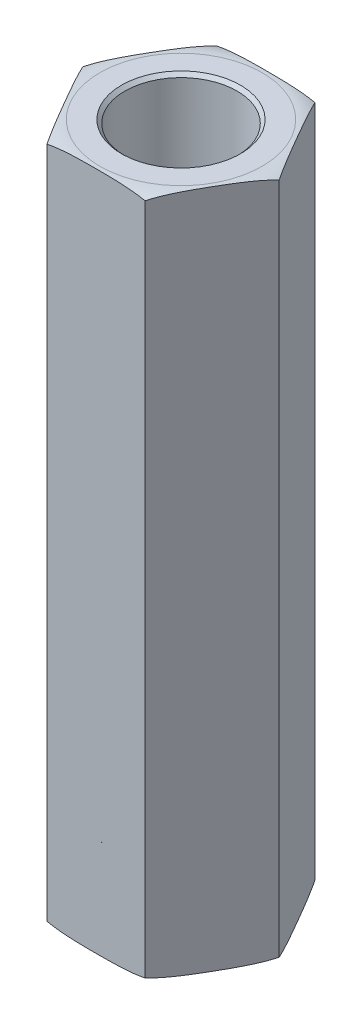
ISO-10303-21;
HEADER;
FILE_DESCRIPTION(('STEP AP214'),'2;1');
FILE_NAME('part.step','',(''),(''),'','','');
FILE_SCHEMA(('AUTOMOTIVE_DESIGN { 1 0 10303 214 1 1 1 1 }'));
ENDSEC;
DATA;
#1=APPLICATION_CONTEXT('core data for automotive mechanical design processes');
#2=APPLICATION_PROTOCOL_DEFINITION('international standard','automotive_design',2000,#1);
#3=PRODUCT_CONTEXT('',#1,'mechanical');
#4=PRODUCT('Part','Part','',(#3));
#5=PRODUCT_RELATED_PRODUCT_CATEGORY('part','',(#4));
#6=PRODUCT_DEFINITION_FORMATION('','',#4);
#7=PRODUCT_DEFINITION_CONTEXT('part definition',#1,'design');
#8=PRODUCT_DEFINITION('design','',#6,#7);
#9=PRODUCT_DEFINITION_SHAPE('','',#8);
#10=(LENGTH_UNIT() NAMED_UNIT(*) SI_UNIT(.MILLI.,.METRE.));
#11=(NAMED_UNIT(*) PLANE_ANGLE_UNIT() SI_UNIT($,.RADIAN.));
#12=(NAMED_UNIT(*) SI_UNIT($,.STERADIAN.) SOLID_ANGLE_UNIT());
#13=UNCERTAINTY_MEASURE_WITH_UNIT(LENGTH_MEASURE(1.E-05),#10,'distance_accuracy_value','');
#14=(GEOMETRIC_REPRESENTATION_CONTEXT(3) GLOBAL_UNCERTAINTY_ASSIGNED_CONTEXT((#13)) GLOBAL_UNIT_ASSIGNED_CONTEXT((#10,
#11,#12)) REPRESENTATION_CONTEXT('',''));
#15=CARTESIAN_POINT('',(0.,0.,0.));
#16=DIRECTION('',(0.,0.,1.));
#17=DIRECTION('',(1.,0.,0.));
#18=AXIS2_PLACEMENT_3D('',#15,#16,#17);
#19=CARTESIAN_POINT('',(3.66617420935412,12.7,0.));
#20=DIRECTION('',(-0.866025403784439,0.,0.5));
#21=DIRECTION('',(0.5,0.,0.866025403784439));
#22=AXIS2_PLACEMENT_3D('',#19,#20,#21);
#23=PLANE('',#22);
#24=CARTESIAN_POINT('',(3.66617420935412,12.573,0.));
#25=CARTESIAN_POINT('',(3.63753042799203,12.5849320246871,-0.0496124846400297));
#26=CARTESIAN_POINT('',(3.60875945805375,12.5955561469422,-0.0994452663561621));
#27=CARTESIAN_POINT('',(3.55104459418749,12.6145286938045,-0.199410342924443));
#28=CARTESIAN_POINT('',(3.52210079717003,12.6228782900808,-0.249542469922647));
#29=CARTESIAN_POINT('',(3.43520914920619,12.6450101508422,-0.400043218949403));
#30=CARTESIAN_POINT('',(3.37708055050428,12.6559225383995,-0.500724905273905));
#31=CARTESIAN_POINT('',(3.26070078255247,12.6725474670846,-0.702300576339511));
#32=CARTESIAN_POINT('',(3.20244972255354,12.6782635139361,-0.8031943718524));
#33=CARTESIAN_POINT('',(3.08586365366194,12.6865432523867,-1.00512736662738));
#34=CARTESIAN_POINT('',(3.0275286156277,12.6891051045623,-1.10616661636415));
#35=CARTESIAN_POINT('',(2.91138213832277,12.6924800878033,-1.30733821617643));
#36=CARTESIAN_POINT('',(2.85357078573449,12.6933089853076,-1.40747041611362));
#37=CARTESIAN_POINT('',(2.73795502274295,12.6939023514638,-1.6077227917708));
#38=CARTESIAN_POINT('',(2.68015061252637,12.6936669720032,-1.70784296716747));
#39=CARTESIAN_POINT('',(2.56452713843035,12.6919339874816,-1.9081086988494));
#40=CARTESIAN_POINT('',(2.50670807591211,12.6904359712302,-2.00825425277698));
#41=CARTESIAN_POINT('',(2.39109525560095,12.6851753167458,-2.20850153156225));
#42=CARTESIAN_POINT('',(2.33330149587791,12.6814129013609,-2.30860325976299));
#43=CARTESIAN_POINT('',(2.23849359853905,12.6719889930382,-2.47281535491267));
#44=CARTESIAN_POINT('',(2.20145192539189,12.6674905766377,-2.5369734148009));
#45=CARTESIAN_POINT('',(2.1274706070678,12.6563014819949,-2.66511281694915));
#46=CARTESIAN_POINT('',(2.09053091530158,12.6496120720916,-2.72909423990419));
#47=CARTESIAN_POINT('',(2.01669860633927,12.6333978038658,-2.85697555026704));
#48=CARTESIAN_POINT('',(1.97980639337019,12.6238652500622,-2.92087473753313));
#49=CARTESIAN_POINT('',(1.90623831426151,12.6012629144562,-3.04829838836461));
#50=CARTESIAN_POINT('',(1.86956287153406,12.5881876787821,-3.11182211855864));
#51=CARTESIAN_POINT('',(1.83308710467706,12.573,-3.175));
#52=B_SPLINE_CURVE_WITH_KNOTS('',3,(#24,#25,#26,#27,#28,#29,#30,#31,#32,#33,#34,#35,#36,#37,#38,
#39,#40,#41,#42,#43,#44,#45,#46,#47,#48,#49,#50,#51),.UNSPECIFIED.,.F.,.F.,(4,2,2,2,2,2,2,2,2,2,
2,2,2,4),(0.,0.175509467388228,0.35092835344326,0.701031261588516,1.05089779629359,
1.400968265255,1.7478396775804,2.09466158796891,2.44159648808714,2.78849725058557,
3.0111319819995,3.23363806003518,3.45675194236249,3.68021127402553),.UNSPECIFIED.);
#53=CARTESIAN_POINT('',(3.66617420935412,12.573,0.));
#54=VERTEX_POINT('',#53);
#55=CARTESIAN_POINT('',(1.83308710467705,12.573,-3.175));
#56=VERTEX_POINT('',#55);
#57=EDGE_CURVE('E107',#54,#56,#52,.T.);
#58=ORIENTED_EDGE('',*,*,#57,.F.);
#59=DIRECTION('',(0.,1.,0.));
#60=VECTOR('',#59,1.);
#61=CARTESIAN_POINT('',(3.66617420935412,12.7,0.));
#62=LINE('',#61,#60);
#63=CARTESIAN_POINT('',(3.66617420935412,-12.573,0.));
#64=VERTEX_POINT('',#63);
#65=EDGE_CURVE('E80',#54,#64,#62,.F.);
#66=ORIENTED_EDGE('',*,*,#65,.T.);
#67=CARTESIAN_POINT('',(1.83308710467705,-12.573,-3.17500000000001));
#68=CARTESIAN_POINT('',(1.86173088603914,-12.5849320246871,-3.12538751535998));
#69=CARTESIAN_POINT('',(1.89050185597742,-12.5955561469422,-3.07555473364385));
#70=CARTESIAN_POINT('',(1.94821671984367,-12.6145286938045,-2.97558965707557));
#71=CARTESIAN_POINT('',(1.97716051686113,-12.6228782900808,-2.92545753007737));
#72=CARTESIAN_POINT('',(2.06405216482497,-12.6450101508422,-2.77495678105062));
#73=CARTESIAN_POINT('',(2.12218076352688,-12.6559225383995,-2.67427509472612));
#74=CARTESIAN_POINT('',(2.23856053147869,-12.6725474670846,-2.47269942366052));
#75=CARTESIAN_POINT('',(2.29681159147761,-12.6782635139361,-2.37180562814763));
#76=CARTESIAN_POINT('',(2.41339766036921,-12.6865432523867,-2.16987263337266));
#77=CARTESIAN_POINT('',(2.47173269840345,-12.6891051045623,-2.06883338363589));
#78=CARTESIAN_POINT('',(2.58787917570837,-12.6924800878033,-1.86766178382362));
#79=CARTESIAN_POINT('',(2.64569052829666,-12.6933089853076,-1.76752958388644));
#80=CARTESIAN_POINT('',(2.76130629128819,-12.6939023514638,-1.56727720822926));
#81=CARTESIAN_POINT('',(2.81911070150477,-12.6936669720032,-1.4671570328326));
#82=CARTESIAN_POINT('',(2.93473417560078,-12.6919339874816,-1.26689130115068));
#83=CARTESIAN_POINT('',(2.99255323811901,-12.6904359712303,-1.16674574722309));
#84=CARTESIAN_POINT('',(3.10816605843017,-12.6851753167458,-0.966498468437835));
#85=CARTESIAN_POINT('',(3.16595981815321,-12.6814129013609,-0.866396740237102));
#86=CARTESIAN_POINT('',(3.26076771549208,-12.6719889930382,-0.702184645087417));
#87=CARTESIAN_POINT('',(3.29780938863924,-12.6674905766377,-0.638026585199176));
#88=CARTESIAN_POINT('',(3.37179070696334,-12.6563014819949,-0.509887183050907));
#89=CARTESIAN_POINT('',(3.40873039872957,-12.6496120720916,-0.445905760095859));
#90=CARTESIAN_POINT('',(3.48256270769189,-12.6333978038658,-0.318024449733001));
#91=CARTESIAN_POINT('',(3.51945492066097,-12.6238652500622,-0.254125262466904));
#92=CARTESIAN_POINT('',(3.59302299976965,-12.6012629144562,-0.126701611635409));
#93=CARTESIAN_POINT('',(3.62969844249711,-12.5881876787821,-0.0631778814413716));
#94=CARTESIAN_POINT('',(3.66617420935412,-12.573,0.));
#95=B_SPLINE_CURVE_WITH_KNOTS('',3,(#67,#68,#69,#70,#71,#72,#73,#74,#75,#76,#77,#78,#79,#80,#81,
#82,#83,#84,#85,#86,#87,#88,#89,#90,#91,#92,#93,#94),.UNSPECIFIED.,.F.,.F.,(4,2,2,2,2,2,2,2,2,2,
2,2,2,4),(0.,0.175509467388222,0.350928353443249,0.701031261588492,1.05089779629356,
1.40096826525495,1.74783967758033,2.09466158796884,2.44159648808706,2.78849725058547,
3.01113198199943,3.23363806003513,3.45675194236246,3.68021127402553),.UNSPECIFIED.);
#96=CARTESIAN_POINT('',(1.83308710467705,-12.573,-3.175));
#97=VERTEX_POINT('',#96);
#98=EDGE_CURVE('E97',#97,#64,#95,.T.);
#99=ORIENTED_EDGE('',*,*,#98,.F.);
#100=DIRECTION('',(0.,1.,0.));
#101=VECTOR('',#100,1.);
#102=CARTESIAN_POINT('',(1.83308710467704,12.7,-3.175));
#103=LINE('',#102,#101);
#104=EDGE_CURVE('E111',#97,#56,#103,.T.);
#105=ORIENTED_EDGE('',*,*,#104,.T.);
#106=EDGE_LOOP('',(#58,#66,#99,#105));
#107=FACE_BOUND('',#106,.T.);
#108=ADVANCED_FACE('F16',(#107),#23,.F.);
#109=CARTESIAN_POINT('',(1.83308710467706,12.7,3.17499999999999));
#110=DIRECTION('',(-0.866025403784439,0.,-0.5));
#111=DIRECTION('',(-0.5,0.,0.866025403784439));
#112=AXIS2_PLACEMENT_3D('',#109,#110,#111);
#113=PLANE('',#112);
#114=CARTESIAN_POINT('',(1.83308710467706,12.573,3.17499999999999));
#115=CARTESIAN_POINT('',(1.86173088603915,12.5849320246871,3.12538751535996));
#116=CARTESIAN_POINT('',(1.89050185597743,12.5955561469422,3.07555473364383));
#117=CARTESIAN_POINT('',(1.94821671984369,12.6145286938045,2.97558965707555));
#118=CARTESIAN_POINT('',(1.97716051686115,12.6228782900808,2.92545753007734));
#119=CARTESIAN_POINT('',(2.06405216482499,12.6450101508422,2.77495678105059));
#120=CARTESIAN_POINT('',(2.1221807635269,12.6559225383995,2.67427509472609));
#121=CARTESIAN_POINT('',(2.23856053147871,12.6725474670846,2.47269942366048));
#122=CARTESIAN_POINT('',(2.29681159147764,12.6782635139361,2.37180562814759));
#123=CARTESIAN_POINT('',(2.41339766036924,12.6865432523867,2.16987263337261));
#124=CARTESIAN_POINT('',(2.47173269840348,12.6891051045623,2.06883338363584));
#125=CARTESIAN_POINT('',(2.58787917570841,12.6924800878033,1.86766178382356));
#126=CARTESIAN_POINT('',(2.6456905282967,12.6933089853076,1.76752958388637));
#127=CARTESIAN_POINT('',(2.76130629128823,12.6939023514638,1.56727720822919));
#128=CARTESIAN_POINT('',(2.81911070150481,12.6936669720032,1.46715703283252));
#129=CARTESIAN_POINT('',(2.93473417560083,12.6919339874816,1.26689130115059));
#130=CARTESIAN_POINT('',(2.99255323811907,12.6904359712302,1.16674574722301));
#131=CARTESIAN_POINT('',(3.10816605843023,12.6851753167458,0.966498468437742));
#132=CARTESIAN_POINT('',(3.16595981815327,12.6814129013609,0.866396740237005));
#133=CARTESIAN_POINT('',(3.26076771549213,12.6719889930382,0.702184645087326));
#134=CARTESIAN_POINT('',(3.29780938863929,12.6674905766377,0.638026585199093));
#135=CARTESIAN_POINT('',(3.37179070696338,12.6563014819949,0.509887183050842));
#136=CARTESIAN_POINT('',(3.4087303987296,12.6496120720916,0.445905760095803));
#137=CARTESIAN_POINT('',(3.48256270769191,12.6333978038658,0.318024449732963));
#138=CARTESIAN_POINT('',(3.51945492066099,12.6238652500622,0.254125262466873));
#139=CARTESIAN_POINT('',(3.59302299976966,12.6012629144562,0.126701611635397));
#140=CARTESIAN_POINT('',(3.62969844249712,12.5881876787821,0.0631778814413677));
#141=CARTESIAN_POINT('',(3.66617420935412,12.573,0.));
#142=B_SPLINE_CURVE_WITH_KNOTS('',3,(#114,#115,#116,#117,#118,#119,#120,#121,#122,#123,#124,
#125,#126,#127,#128,#129,#130,#131,#132,#133,#134,#135,#136,#137,#138,#139,#140,#141),
.UNSPECIFIED.,.F.,.F.,(4,2,2,2,2,2,2,2,2,2,2,2,2,4),(0.,0.175509467388228,0.350928353443261,
0.701031261588517,1.05089779629359,1.400968265255,1.7478396775804,2.09466158796891,
2.44159648808714,2.78849725058557,3.01113198199949,3.23363806003517,3.45675194236247,
3.68021127402551),.UNSPECIFIED.);
#143=CARTESIAN_POINT('',(1.83308710467706,12.573,3.17499999999999));
#144=VERTEX_POINT('',#143);
#145=EDGE_CURVE('E21',#144,#54,#142,.T.);
#146=ORIENTED_EDGE('',*,*,#145,.F.);
#147=DIRECTION('',(0.,1.,0.));
#148=VECTOR('',#147,1.);
#149=CARTESIAN_POINT('',(1.83308710467706,12.7,3.17499999999999));
#150=LINE('',#149,#148);
#151=CARTESIAN_POINT('',(1.83308710467706,-12.573,3.17499999999999));
#152=VERTEX_POINT('',#151);
#153=EDGE_CURVE('E100',#144,#152,#150,.F.);
#154=ORIENTED_EDGE('',*,*,#153,.T.);
#155=CARTESIAN_POINT('',(3.66617420935412,-12.573,0.));
#156=CARTESIAN_POINT('',(3.63753042799203,-12.5849320246871,0.0496124846400342));
#157=CARTESIAN_POINT('',(3.60875945805375,-12.5955561469422,0.0994452663561657));
#158=CARTESIAN_POINT('',(3.5510445941875,-12.6145286938045,0.199410342924445));
#159=CARTESIAN_POINT('',(3.52210079717003,-12.6228782900808,0.249542469922648));
#160=CARTESIAN_POINT('',(3.4352091492062,-12.6450101508422,0.400043218949402));
#161=CARTESIAN_POINT('',(3.37708055050428,-12.6559225383995,0.500724905273903));
#162=CARTESIAN_POINT('',(3.26070078255248,-12.6725474670846,0.702300576339505));
#163=CARTESIAN_POINT('',(3.20244972255355,-12.6782635139361,0.803194371852393));
#164=CARTESIAN_POINT('',(3.08586365366195,-12.6865432523867,1.00512736662737));
#165=CARTESIAN_POINT('',(3.02752861562771,-12.6891051045623,1.10616661636414));
#166=CARTESIAN_POINT('',(2.91138213832278,-12.6924800878033,1.30733821617642));
#167=CARTESIAN_POINT('',(2.8535707857345,-12.6933089853076,1.4074704161136));
#168=CARTESIAN_POINT('',(2.73795502274296,-12.6939023514638,1.60772279177078));
#169=CARTESIAN_POINT('',(2.68015061252638,-12.6936669720032,1.70784296716745));
#170=CARTESIAN_POINT('',(2.56452713843037,-12.6919339874816,1.90810869884937));
#171=CARTESIAN_POINT('',(2.50670807591213,-12.6904359712303,2.00825425277696));
#172=CARTESIAN_POINT('',(2.39109525560097,-12.6851753167458,2.20850153156222));
#173=CARTESIAN_POINT('',(2.33330149587793,-12.6814129013609,2.30860325976296));
#174=CARTESIAN_POINT('',(2.23849359853907,-12.6719889930382,2.47281535491264));
#175=CARTESIAN_POINT('',(2.20145192539191,-12.6674905766377,2.53697341480087));
#176=CARTESIAN_POINT('',(2.12747060706782,-12.6563014819949,2.66511281694913));
#177=CARTESIAN_POINT('',(2.09053091530159,-12.6496120720916,2.72909423990417));
#178=CARTESIAN_POINT('',(2.01669860633928,-12.6333978038658,2.85697555026702));
#179=CARTESIAN_POINT('',(1.9798063933702,-12.6238652500622,2.92087473753311));
#180=CARTESIAN_POINT('',(1.90623831426152,-12.6012629144562,3.04829838836459));
#181=CARTESIAN_POINT('',(1.86956287153407,-12.5881876787821,3.11182211855863));
#182=CARTESIAN_POINT('',(1.83308710467706,-12.573,3.17499999999999));
#183=B_SPLINE_CURVE_WITH_KNOTS('',3,(#155,#156,#157,#158,#159,#160,#161,#162,#163,#164,#165,
#166,#167,#168,#169,#170,#171,#172,#173,#174,#175,#176,#177,#178,#179,#180,#181,#182),
.UNSPECIFIED.,.F.,.F.,(4,2,2,2,2,2,2,2,2,2,2,2,2,4),(0.,0.175509467388225,0.350928353443254,
0.701031261588505,1.05089779629358,1.40096826525497,1.74783967758037,2.09466158796888,
2.44159648808711,2.78849725058553,3.01113198199946,3.23363806003515,3.45675194236246,
3.68021127402551),.UNSPECIFIED.);
#184=EDGE_CURVE('E214',#64,#152,#183,.T.);
#185=ORIENTED_EDGE('',*,*,#184,.F.);
#186=ORIENTED_EDGE('',*,*,#65,.F.);
#187=EDGE_LOOP('',(#146,#154,#185,#186));
#188=FACE_BOUND('',#187,.T.);
#189=ADVANCED_FACE('F106',(#188),#113,.F.);
#190=CARTESIAN_POINT('',(-1.83308710467707,12.7,3.175));
#191=DIRECTION('',(0.,0.,-1.));
#192=DIRECTION('',(-1.,0.,0.));
#193=AXIS2_PLACEMENT_3D('',#190,#191,#192);
#194=PLANE('',#193);
#195=ORIENTED_EDGE('',*,*,#153,.F.);
#196=CARTESIAN_POINT('',(-1.83308710467707,12.573,3.175));
#197=CARTESIAN_POINT('',(-1.75760871054776,12.5887123012236,3.175));
#198=CARTESIAN_POINT('',(-1.68170571468658,12.6021647800808,3.175));
#199=CARTESIAN_POINT('',(-1.52939807527773,12.625304864701,3.175));
#200=CARTESIAN_POINT('',(-1.45299400110164,12.6349961750272,3.175));
#201=CARTESIAN_POINT('',(-1.30011823209764,12.6513713526714,3.175));
#202=CARTESIAN_POINT('',(-1.22364747610196,12.6580644224785,3.175));
#203=CARTESIAN_POINT('',(-1.07052459410173,12.6691724169975,3.175));
#204=CARTESIAN_POINT('',(-0.993872424115957,12.6735867165543,3.175));
#205=CARTESIAN_POINT('',(-0.840856910195846,12.680724198028,3.175));
#206=CARTESIAN_POINT('',(-0.764493913329282,12.6834552736779,3.175));
#207=CARTESIAN_POINT('',(-0.611734616938516,12.68775632258,3.175));
#208=CARTESIAN_POINT('',(-0.53533831633141,12.6893262547388,3.175));
#209=CARTESIAN_POINT('',(-0.38245423122642,12.6916824707657,3.175));
#210=CARTESIAN_POINT('',(-0.305966435115039,12.6924679275964,3.175));
#211=CARTESIAN_POINT('',(-0.152985759387013,12.69348841069,3.175));
#212=CARTESIAN_POINT('',(-0.0764928796935068,12.6937234241492,3.175));
#213=CARTESIAN_POINT('',(0.0764928796935056,12.6937234241492,3.175));
#214=CARTESIAN_POINT('',(0.152985759387012,12.69348841069,3.17499999999999));
#215=CARTESIAN_POINT('',(0.305966435115038,12.6924679275964,3.17499999999999));
#216=CARTESIAN_POINT('',(0.382454231226419,12.6916824707657,3.17499999999999));
#217=CARTESIAN_POINT('',(0.535338316331407,12.6893262547388,3.17499999999999));
#218=CARTESIAN_POINT('',(0.611734616938514,12.68775632258,3.17499999999999));
#219=CARTESIAN_POINT('',(0.764493913329279,12.6834552736779,3.17499999999999));
#220=CARTESIAN_POINT('',(0.840856910195843,12.680724198028,3.17499999999999));
#221=CARTESIAN_POINT('',(0.993872424115954,12.6735867165543,3.17499999999999));
#222=CARTESIAN_POINT('',(1.07052459410172,12.6691724169975,3.17499999999999));
#223=CARTESIAN_POINT('',(1.22364747610196,12.6580644224785,3.17499999999999));
#224=CARTESIAN_POINT('',(1.30011823209763,12.6513713526714,3.17499999999999));
#225=CARTESIAN_POINT('',(1.45299400110163,12.6349961750272,3.17499999999999));
#226=CARTESIAN_POINT('',(1.52939807527773,12.625304864701,3.17499999999999));
#227=CARTESIAN_POINT('',(1.68170571468658,12.6021647800808,3.17499999999999));
#228=CARTESIAN_POINT('',(1.75760871054776,12.5887123012237,3.17499999999999));
#229=CARTESIAN_POINT('',(1.83308710467706,12.573,3.17499999999999));
#230=B_SPLINE_CURVE_WITH_KNOTS('',3,(#196,#197,#198,#199,#200,#201,#202,#203,#204,#205,#206,
#207,#208,#209,#210,#211,#212,#213,#214,#215,#216,#217,#218,#219,#220,#221,#222,#223,#224,#225,
#226,#227,#228,#229),.UNSPECIFIED.,.F.,.F.,(4,2,2,2,2,2,2,2,2,2,2,2,2,2,2,2,4),(0.,
0.23119079437731,0.46215329593589,0.692401964780504,0.922713766248053,1.15193709952408,
1.3811685447265,1.61064140410055,1.84011960111017,2.06959779811978,2.29907065749383,
2.52830210269625,2.75752543597228,2.98783723743982,3.21808590628444,3.44904840784302,
3.68023920222033),.UNSPECIFIED.);
#231=CARTESIAN_POINT('',(-1.83308710467707,12.573,3.175));
#232=VERTEX_POINT('',#231);
#233=EDGE_CURVE('E86',#232,#144,#230,.T.);
#234=ORIENTED_EDGE('',*,*,#233,.F.);
#235=DIRECTION('',(0.,1.,0.));
#236=VECTOR('',#235,1.);
#237=CARTESIAN_POINT('',(-1.83308710467707,12.7,3.175));
#238=LINE('',#237,#236);
#239=CARTESIAN_POINT('',(-1.83308710467707,-12.573,3.175));
#240=VERTEX_POINT('',#239);
#241=EDGE_CURVE('E104',#232,#240,#238,.F.);
#242=ORIENTED_EDGE('',*,*,#241,.T.);
#243=CARTESIAN_POINT('',(1.83308710467706,-12.573,3.17499999999999));
#244=CARTESIAN_POINT('',(1.75760871054776,-12.5887123012236,3.17499999999999));
#245=CARTESIAN_POINT('',(1.68170571468658,-12.6021647800808,3.17499999999999));
#246=CARTESIAN_POINT('',(1.52939807527773,-12.625304864701,3.17499999999999));
#247=CARTESIAN_POINT('',(1.45299400110163,-12.6349961750272,3.17499999999999));
#248=CARTESIAN_POINT('',(1.30011823209763,-12.6513713526714,3.17499999999999));
#249=CARTESIAN_POINT('',(1.22364747610196,-12.6580644224785,3.17499999999999));
#250=CARTESIAN_POINT('',(1.07052459410172,-12.6691724169975,3.17499999999999));
#251=CARTESIAN_POINT('',(0.993872424115954,-12.6735867165543,3.17499999999999));
#252=CARTESIAN_POINT('',(0.840856910195844,-12.680724198028,3.17499999999999));
#253=CARTESIAN_POINT('',(0.76449391332928,-12.6834552736779,3.17499999999999));
#254=CARTESIAN_POINT('',(0.611734616938514,-12.68775632258,3.17499999999999));
#255=CARTESIAN_POINT('',(0.535338316331408,-12.6893262547388,3.17499999999999));
#256=CARTESIAN_POINT('',(0.382454231226419,-12.6916824707657,3.17499999999999));
#257=CARTESIAN_POINT('',(0.305966435115038,-12.6924679275964,3.17499999999999));
#258=CARTESIAN_POINT('',(0.152985759387012,-12.69348841069,3.17499999999999));
#259=CARTESIAN_POINT('',(0.0764928796935062,-12.6937234241492,3.175));
#260=CARTESIAN_POINT('',(-0.0764928796935061,-12.6937234241492,3.175));
#261=CARTESIAN_POINT('',(-0.152985759387012,-12.69348841069,3.175));
#262=CARTESIAN_POINT('',(-0.305966435115039,-12.6924679275964,3.175));
#263=CARTESIAN_POINT('',(-0.382454231226419,-12.6916824707657,3.175));
#264=CARTESIAN_POINT('',(-0.535338316331408,-12.6893262547388,3.175));
#265=CARTESIAN_POINT('',(-0.611734616938515,-12.68775632258,3.175));
#266=CARTESIAN_POINT('',(-0.764493913329281,-12.6834552736779,3.175));
#267=CARTESIAN_POINT('',(-0.840856910195844,-12.680724198028,3.175));
#268=CARTESIAN_POINT('',(-0.993872424115955,-12.6735867165543,3.175));
#269=CARTESIAN_POINT('',(-1.07052459410172,-12.6691724169975,3.175));
#270=CARTESIAN_POINT('',(-1.22364747610196,-12.6580644224785,3.175));
#271=CARTESIAN_POINT('',(-1.30011823209763,-12.6513713526714,3.175));
#272=CARTESIAN_POINT('',(-1.45299400110163,-12.6349961750272,3.175));
#273=CARTESIAN_POINT('',(-1.52939807527773,-12.625304864701,3.175));
#274=CARTESIAN_POINT('',(-1.68170571468658,-12.6021647800808,3.175));
#275=CARTESIAN_POINT('',(-1.75760871054776,-12.5887123012237,3.175));
#276=CARTESIAN_POINT('',(-1.83308710467706,-12.573,3.175));
#277=B_SPLINE_CURVE_WITH_KNOTS('',3,(#243,#244,#245,#246,#247,#248,#249,#250,#251,#252,#253,
#254,#255,#256,#257,#258,#259,#260,#261,#262,#263,#264,#265,#266,#267,#268,#269,#270,#271,#272,
#273,#274,#275,#276),.UNSPECIFIED.,.F.,.F.,(4,2,2,2,2,2,2,2,2,2,2,2,2,2,2,2,4),(0.,
0.23119079437731,0.462153295935889,0.692401964780503,0.92271376624805,1.15193709952407,
1.3811685447265,1.61064140410055,1.84011960111016,2.06959779811977,2.29907065749383,
2.52830210269625,2.75752543597227,2.98783723743982,3.21808590628443,3.44904840784301,
3.68023920222032),.UNSPECIFIED.);
#278=EDGE_CURVE('E102',#152,#240,#277,.T.);
#279=ORIENTED_EDGE('',*,*,#278,.F.);
#280=EDGE_LOOP('',(#195,#234,#242,#279));
#281=FACE_BOUND('',#280,.T.);
#282=ADVANCED_FACE('F101',(#281),#194,.F.);
#283=CARTESIAN_POINT('',(-3.66617420935413,12.7,0.));
#284=DIRECTION('',(0.866025403784439,0.,-0.499999999999999));
#285=DIRECTION('',(-0.499999999999999,0.,-0.866025403784439));
#286=AXIS2_PLACEMENT_3D('',#283,#284,#285);
#287=PLANE('',#286);
#288=CARTESIAN_POINT('',(-3.66617420935412,12.573,0.));
#289=CARTESIAN_POINT('',(-3.63753042799204,12.5849320246871,0.0496124846400257));
#290=CARTESIAN_POINT('',(-3.60875945805376,12.5955561469422,0.0994452663561537));
#291=CARTESIAN_POINT('',(-3.55104459418751,12.6145286938045,0.199410342924426));
#292=CARTESIAN_POINT('',(-3.52210079717005,12.6228782900808,0.249542469922626));
#293=CARTESIAN_POINT('',(-3.43520914920622,12.6450101508421,0.400043218949369));
#294=CARTESIAN_POINT('',(-3.37708055050431,12.6559225383995,0.500724905273863));
#295=CARTESIAN_POINT('',(-3.26070078255251,12.6725474670846,0.702300576339452));
#296=CARTESIAN_POINT('',(-3.20244972255359,12.6782635139361,0.803194371852333));
#297=CARTESIAN_POINT('',(-3.085863653662,12.6865432523867,1.0051273666273));
#298=CARTESIAN_POINT('',(-3.02752861562776,12.6891051045623,1.10616661636406));
#299=CARTESIAN_POINT('',(-2.91138213832284,12.6924800878033,1.30733821617632));
#300=CARTESIAN_POINT('',(-2.85357078573456,12.6933089853076,1.4074704161135));
#301=CARTESIAN_POINT('',(-2.73795502274304,12.6939023514638,1.60772279177067));
#302=CARTESIAN_POINT('',(-2.68015061252646,12.6936669720032,1.70784296716733));
#303=CARTESIAN_POINT('',(-2.56452713843045,12.6919339874816,1.90810869884924));
#304=CARTESIAN_POINT('',(-2.50670807591222,12.6904359712303,2.00825425277682));
#305=CARTESIAN_POINT('',(-2.39109525560107,12.6851753167458,2.20850153156206));
#306=CARTESIAN_POINT('',(-2.33330149587803,12.6814129013609,2.30860325976279));
#307=CARTESIAN_POINT('',(-2.23849359853917,12.6719889930382,2.47281535491248));
#308=CARTESIAN_POINT('',(-2.201451925392,12.6674905766377,2.53697341480073));
#309=CARTESIAN_POINT('',(-2.12747060706789,12.6563014819949,2.66511281694902));
#310=CARTESIAN_POINT('',(-2.09053091530165,12.6496120720916,2.72909423990408));
#311=CARTESIAN_POINT('',(-2.01669860633933,12.6333978038658,2.85697555026695));
#312=CARTESIAN_POINT('',(-1.97980639337024,12.6238652500622,2.92087473753306));
#313=CARTESIAN_POINT('',(-1.90623831426154,12.6012629144562,3.04829838836457));
#314=CARTESIAN_POINT('',(-1.86956287153408,12.5881876787821,3.11182211855862));
#315=CARTESIAN_POINT('',(-1.83308710467707,12.573,3.175));
#316=B_SPLINE_CURVE_WITH_KNOTS('',3,(#288,#289,#290,#291,#292,#293,#294,#295,#296,#297,#298,
#299,#300,#301,#302,#303,#304,#305,#306,#307,#308,#309,#310,#311,#312,#313,#314,#315),
.UNSPECIFIED.,.F.,.F.,(4,2,2,2,2,2,2,2,2,2,2,2,2,4),(0.,0.175509467388213,0.350928353443231,
0.701031261588458,1.0508977962935,1.40096826525488,1.74783967758025,2.09466158796874,
2.44159648808694,2.78849725058534,3.01113198199932,3.23363806003506,3.45675194236242,
3.68021127402552),.UNSPECIFIED.);
#317=CARTESIAN_POINT('',(-3.66617420935413,12.573,0.));
#318=VERTEX_POINT('',#317);
#319=EDGE_CURVE('E94',#318,#232,#316,.T.);
#320=ORIENTED_EDGE('',*,*,#319,.F.);
#321=DIRECTION('',(0.,1.,0.));
#322=VECTOR('',#321,1.);
#323=CARTESIAN_POINT('',(-3.66617420935413,12.7,0.));
#324=LINE('',#323,#322);
#325=CARTESIAN_POINT('',(-3.66617420935413,-12.573,0.));
#326=VERTEX_POINT('',#325);
#327=EDGE_CURVE('E118',#318,#326,#324,.F.);
#328=ORIENTED_EDGE('',*,*,#327,.T.);
#329=CARTESIAN_POINT('',(-1.83308710467707,-12.573,3.175));
#330=CARTESIAN_POINT('',(-1.86173088603915,-12.5849320246871,3.12538751535997));
#331=CARTESIAN_POINT('',(-1.89050185597743,-12.5955561469422,3.07555473364385));
#332=CARTESIAN_POINT('',(-1.94821671984368,-12.6145286938045,2.97558965707557));
#333=CARTESIAN_POINT('',(-1.97716051686114,-12.6228782900808,2.92545753007737));
#334=CARTESIAN_POINT('',(-2.06405216482497,-12.6450101508421,2.77495678105063));
#335=CARTESIAN_POINT('',(-2.12218076352688,-12.6559225383995,2.67427509472614));
#336=CARTESIAN_POINT('',(-2.23856053147868,-12.6725474670846,2.47269942366055));
#337=CARTESIAN_POINT('',(-2.2968115914776,-12.6782635139361,2.37180562814767));
#338=CARTESIAN_POINT('',(-2.41339766036919,-12.6865432523867,2.16987263337271));
#339=CARTESIAN_POINT('',(-2.47173269840343,-12.6891051045623,2.06883338363595));
#340=CARTESIAN_POINT('',(-2.58787917570834,-12.6924800878033,1.86766178382369));
#341=CARTESIAN_POINT('',(-2.64569052829662,-12.6933089853076,1.76752958388651));
#342=CARTESIAN_POINT('',(-2.76130629128815,-12.6939023514638,1.56727720822934));
#343=CARTESIAN_POINT('',(-2.81911070150472,-12.6936669720032,1.46715703283268));
#344=CARTESIAN_POINT('',(-2.93473417560073,-12.6919339874816,1.26689130115078));
#345=CARTESIAN_POINT('',(-2.99255323811896,-12.6904359712303,1.1667457472232));
#346=CARTESIAN_POINT('',(-3.10816605843011,-12.6851753167458,0.966498468437951));
#347=CARTESIAN_POINT('',(-3.16595981815315,-12.6814129013609,0.866396740237223));
#348=CARTESIAN_POINT('',(-3.26076771549202,-12.6719889930382,0.702184645087533));
#349=CARTESIAN_POINT('',(-3.29780938863918,-12.6674905766377,0.638026585199281));
#350=CARTESIAN_POINT('',(-3.37179070696329,-12.6563014819949,0.509887183050991));
#351=CARTESIAN_POINT('',(-3.40873039872953,-12.6496120720916,0.445905760095933));
#352=CARTESIAN_POINT('',(-3.48256270769186,-12.6333978038658,0.318024449733054));
#353=CARTESIAN_POINT('',(-3.51945492066095,-12.6238652500622,0.254125262466946));
#354=CARTESIAN_POINT('',(-3.59302299976965,-12.6012629144562,0.126701611635431));
#355=CARTESIAN_POINT('',(-3.62969844249711,-12.5881876787821,0.0631778814413828));
#356=CARTESIAN_POINT('',(-3.66617420935412,-12.573,0.));
#357=B_SPLINE_CURVE_WITH_KNOTS('',3,(#329,#330,#331,#332,#333,#334,#335,#336,#337,#338,#339,
#340,#341,#342,#343,#344,#345,#346,#347,#348,#349,#350,#351,#352,#353,#354,#355,#356),
.UNSPECIFIED.,.F.,.F.,(4,2,2,2,2,2,2,2,2,2,2,2,2,4),(0.,0.175509467388212,0.350928353443228,
0.701031261588452,1.0508977962935,1.40096826525487,1.74783967758024,2.09466158796872,
2.44159648808692,2.78849725058532,3.01113198199931,3.23363806003505,3.45675194236242,
3.68021127402552),.UNSPECIFIED.);
#358=EDGE_CURVE('E203',#240,#326,#357,.T.);
#359=ORIENTED_EDGE('',*,*,#358,.F.);
#360=ORIENTED_EDGE('',*,*,#241,.F.);
#361=EDGE_LOOP('',(#320,#328,#359,#360));
#362=FACE_BOUND('',#361,.T.);
#363=ADVANCED_FACE('F197',(#362),#287,.F.);
#364=CARTESIAN_POINT('',(-1.83308710467707,12.7,-3.175));
#365=DIRECTION('',(0.866025403784439,0.,0.5));
#366=DIRECTION('',(0.5,0.,-0.866025403784439));
#367=AXIS2_PLACEMENT_3D('',#364,#365,#366);
#368=PLANE('',#367);
#369=CARTESIAN_POINT('',(-1.83308710467706,12.573,-3.17500000000001));
#370=CARTESIAN_POINT('',(-1.86173088603915,12.5849320246871,-3.12538751535998));
#371=CARTESIAN_POINT('',(-1.89050185597742,12.5955561469422,-3.07555473364386));
#372=CARTESIAN_POINT('',(-1.94821671984367,12.6145286938044,-2.97558965707559));
#373=CARTESIAN_POINT('',(-1.97716051686113,12.6228782900808,-2.92545753007739));
#374=CARTESIAN_POINT('',(-2.06405216482496,12.6450101508421,-2.77495678105065));
#375=CARTESIAN_POINT('',(-2.12218076352687,12.6559225383995,-2.67427509472615));
#376=CARTESIAN_POINT('',(-2.23856053147867,12.6725474670846,-2.47269942366057));
#377=CARTESIAN_POINT('',(-2.29681159147759,12.6782635139361,-2.37180562814769));
#378=CARTESIAN_POINT('',(-2.41339766036918,12.6865432523867,-2.16987263337273));
#379=CARTESIAN_POINT('',(-2.47173269840342,12.6891051045623,-2.06883338363597));
#380=CARTESIAN_POINT('',(-2.58787917570833,12.6924800878033,-1.86766178382371));
#381=CARTESIAN_POINT('',(-2.64569052829661,12.6933089853076,-1.76752958388653));
#382=CARTESIAN_POINT('',(-2.76130629128814,12.6939023514638,-1.56727720822937));
#383=CARTESIAN_POINT('',(-2.81911070150471,12.6936669720032,-1.46715703283271));
#384=CARTESIAN_POINT('',(-2.93473417560072,12.6919339874816,-1.26689130115081));
#385=CARTESIAN_POINT('',(-2.99255323811895,12.6904359712303,-1.16674574722323));
#386=CARTESIAN_POINT('',(-3.1081660584301,12.6851753167458,-0.966498468437983));
#387=CARTESIAN_POINT('',(-3.16595981815313,12.6814129013609,-0.866396740237256));
#388=CARTESIAN_POINT('',(-3.260767715492,12.6719889930382,-0.702184645087565));
#389=CARTESIAN_POINT('',(-3.29780938863917,12.6674905766377,-0.638026585199311));
#390=CARTESIAN_POINT('',(-3.37179070696328,12.6563014819949,-0.509887183051016));
#391=CARTESIAN_POINT('',(-3.40873039872952,12.6496120720916,-0.445905760095955));
#392=CARTESIAN_POINT('',(-3.48256270769186,12.6333978038658,-0.318024449733071));
#393=CARTESIAN_POINT('',(-3.51945492066095,12.6238652500622,-0.25412526246696));
#394=CARTESIAN_POINT('',(-3.59302299976965,12.6012629144562,-0.126701611635439));
#395=CARTESIAN_POINT('',(-3.62969844249711,12.5881876787821,-0.0631778814413886));
#396=CARTESIAN_POINT('',(-3.66617420935413,12.573,0.));
#397=B_SPLINE_CURVE_WITH_KNOTS('',3,(#369,#370,#371,#372,#373,#374,#375,#376,#377,#378,#379,
#380,#381,#382,#383,#384,#385,#386,#387,#388,#389,#390,#391,#392,#393,#394,#395,#396),
.UNSPECIFIED.,.F.,.F.,(4,2,2,2,2,2,2,2,2,2,2,2,2,4),(0.,0.17550946738821,0.350928353443225,
0.701031261588445,1.05089779629349,1.40096826525485,1.74783967758022,2.0946615879687,
2.4415964880869,2.78849725058529,3.01113198199929,3.23363806003504,3.45675194236242,
3.68021127402553),.UNSPECIFIED.);
#398=CARTESIAN_POINT('',(-1.83308710467706,12.573,-3.175));
#399=VERTEX_POINT('',#398);
#400=EDGE_CURVE('E169',#399,#318,#397,.T.);
#401=ORIENTED_EDGE('',*,*,#400,.F.);
#402=DIRECTION('',(0.,1.,0.));
#403=VECTOR('',#402,1.);
#404=CARTESIAN_POINT('',(-1.83308710467706,12.7,-3.175));
#405=LINE('',#404,#403);
#406=CARTESIAN_POINT('',(-1.83308710467707,-12.573,-3.175));
#407=VERTEX_POINT('',#406);
#408=EDGE_CURVE('E108',#399,#407,#405,.F.);
#409=ORIENTED_EDGE('',*,*,#408,.T.);
#410=CARTESIAN_POINT('',(-3.66617420935413,-12.573,0.));
#411=CARTESIAN_POINT('',(-3.63753042799204,-12.5849320246871,-0.049612484640029));
#412=CARTESIAN_POINT('',(-3.60875945805377,-12.5955561469422,-0.0994452663561569));
#413=CARTESIAN_POINT('',(-3.55104459418751,-12.6145286938045,-0.199410342924429));
#414=CARTESIAN_POINT('',(-3.52210079717006,-12.6228782900808,-0.249542469922628));
#415=CARTESIAN_POINT('',(-3.43520914920623,-12.6450101508421,-0.400043218949371));
#416=CARTESIAN_POINT('',(-3.37708055050431,-12.6559225383995,-0.500724905273863));
#417=CARTESIAN_POINT('',(-3.26070078255252,-12.6725474670846,-0.702300576339451));
#418=CARTESIAN_POINT('',(-3.20244972255359,-12.6782635139361,-0.803194371852331));
#419=CARTESIAN_POINT('',(-3.085863653662,-12.6865432523867,-1.00512736662729));
#420=CARTESIAN_POINT('',(-3.02752861562776,-12.6891051045623,-1.10616661636406));
#421=CARTESIAN_POINT('',(-2.91138213832285,-12.6924800878033,-1.30733821617632));
#422=CARTESIAN_POINT('',(-2.85357078573457,-12.6933089853076,-1.40747041611349));
#423=CARTESIAN_POINT('',(-2.73795502274304,-12.6939023514638,-1.60772279177066));
#424=CARTESIAN_POINT('',(-2.68015061252647,-12.6936669720032,-1.70784296716732));
#425=CARTESIAN_POINT('',(-2.56452713843046,-12.6919339874816,-1.90810869884923));
#426=CARTESIAN_POINT('',(-2.50670807591223,-12.6904359712303,-2.00825425277681));
#427=CARTESIAN_POINT('',(-2.39109525560108,-12.6851753167458,-2.20850153156205));
#428=CARTESIAN_POINT('',(-2.33330149587804,-12.6814129013609,-2.30860325976278));
#429=CARTESIAN_POINT('',(-2.23849359853918,-12.6719889930382,-2.47281535491247));
#430=CARTESIAN_POINT('',(-2.20145192539201,-12.6674905766377,-2.53697341480072));
#431=CARTESIAN_POINT('',(-2.1274706070679,-12.6563014819949,-2.66511281694901));
#432=CARTESIAN_POINT('',(-2.09053091530166,-12.6496120720916,-2.72909423990407));
#433=CARTESIAN_POINT('',(-2.01669860633933,-12.6333978038658,-2.85697555026695));
#434=CARTESIAN_POINT('',(-1.97980639337024,-12.6238652500622,-2.92087473753306));
#435=CARTESIAN_POINT('',(-1.90623831426154,-12.6012629144562,-3.04829838836457));
#436=CARTESIAN_POINT('',(-1.86956287153408,-12.5881876787821,-3.11182211855862));
#437=CARTESIAN_POINT('',(-1.83308710467707,-12.573,-3.175));
#438=B_SPLINE_CURVE_WITH_KNOTS('',3,(#410,#411,#412,#413,#414,#415,#416,#417,#418,#419,#420,
#421,#422,#423,#424,#425,#426,#427,#428,#429,#430,#431,#432,#433,#434,#435,#436,#437),
.UNSPECIFIED.,.F.,.F.,(4,2,2,2,2,2,2,2,2,2,2,2,2,4),(0.,0.175509467388213,0.350928353443229,
0.701031261588453,1.0508977962935,1.40096826525487,1.74783967758024,2.09466158796873,
2.44159648808692,2.78849725058532,3.01113198199931,3.23363806003505,3.45675194236242,
3.68021127402553),.UNSPECIFIED.);
#439=EDGE_CURVE('E143',#326,#407,#438,.T.);
#440=ORIENTED_EDGE('',*,*,#439,.F.);
#441=ORIENTED_EDGE('',*,*,#327,.F.);
#442=EDGE_LOOP('',(#401,#409,#440,#441));
#443=FACE_BOUND('',#442,.T.);
#444=ADVANCED_FACE('F154',(#443),#368,.F.);
#445=CARTESIAN_POINT('',(1.83308710467706,12.7,-3.175));
#446=DIRECTION('',(0.,0.,1.));
#447=DIRECTION('',(1.,0.,0.));
#448=AXIS2_PLACEMENT_3D('',#445,#446,#447);
#449=PLANE('',#448);
#450=CARTESIAN_POINT('',(1.83308710467706,12.573,-3.175));
#451=CARTESIAN_POINT('',(1.75760871054775,12.5887123012236,-3.175));
#452=CARTESIAN_POINT('',(1.68170571468657,12.6021647800808,-3.175));
#453=CARTESIAN_POINT('',(1.52939807527772,12.625304864701,-3.175));
#454=CARTESIAN_POINT('',(1.45299400110162,12.6349961750272,-3.175));
#455=CARTESIAN_POINT('',(1.30011823209763,12.6513713526714,-3.175));
#456=CARTESIAN_POINT('',(1.22364747610195,12.6580644224785,-3.175));
#457=CARTESIAN_POINT('',(1.07052459410172,12.6691724169975,-3.175));
#458=CARTESIAN_POINT('',(0.99387242411595,12.6735867165543,-3.175));
#459=CARTESIAN_POINT('',(0.840856910195841,12.680724198028,-3.175));
#460=CARTESIAN_POINT('',(0.764493913329277,12.6834552736779,-3.175));
#461=CARTESIAN_POINT('',(0.611734616938512,12.68775632258,-3.175));
#462=CARTESIAN_POINT('',(0.535338316331406,12.6893262547388,-3.175));
#463=CARTESIAN_POINT('',(0.382454231226418,12.6916824707657,-3.175));
#464=CARTESIAN_POINT('',(0.305966435115037,12.6924679275964,-3.175));
#465=CARTESIAN_POINT('',(0.152985759387012,12.69348841069,-3.175));
#466=CARTESIAN_POINT('',(0.0764928796935061,12.6937234241492,-3.175));
#467=CARTESIAN_POINT('',(-0.0764928796935054,12.6937234241492,-3.175));
#468=CARTESIAN_POINT('',(-0.152985759387011,12.69348841069,-3.175));
#469=CARTESIAN_POINT('',(-0.305966435115037,12.6924679275964,-3.175));
#470=CARTESIAN_POINT('',(-0.382454231226417,12.6916824707657,-3.175));
#471=CARTESIAN_POINT('',(-0.535338316331406,12.6893262547388,-3.175));
#472=CARTESIAN_POINT('',(-0.611734616938512,12.68775632258,-3.175));
#473=CARTESIAN_POINT('',(-0.764493913329277,12.6834552736779,-3.175));
#474=CARTESIAN_POINT('',(-0.840856910195841,12.680724198028,-3.175));
#475=CARTESIAN_POINT('',(-0.99387242411595,12.6735867165543,-3.175));
#476=CARTESIAN_POINT('',(-1.07052459410172,12.6691724169975,-3.175));
#477=CARTESIAN_POINT('',(-1.22364747610195,12.6580644224785,-3.175));
#478=CARTESIAN_POINT('',(-1.30011823209763,12.6513713526714,-3.175));
#479=CARTESIAN_POINT('',(-1.45299400110163,12.6349961750272,-3.175));
#480=CARTESIAN_POINT('',(-1.52939807527772,12.625304864701,-3.175));
#481=CARTESIAN_POINT('',(-1.68170571468657,12.6021647800808,-3.175));
#482=CARTESIAN_POINT('',(-1.75760871054775,12.5887123012236,-3.175));
#483=CARTESIAN_POINT('',(-1.83308710467706,12.573,-3.175));
#484=B_SPLINE_CURVE_WITH_KNOTS('',3,(#450,#451,#452,#453,#454,#455,#456,#457,#458,#459,#460,
#461,#462,#463,#464,#465,#466,#467,#468,#469,#470,#471,#472,#473,#474,#475,#476,#477,#478,#479,
#480,#481,#482,#483),.UNSPECIFIED.,.F.,.F.,(4,2,2,2,2,2,2,2,2,2,2,2,2,2,2,2,4),(0.,
0.231190794377308,0.462153295935886,0.692401964780499,0.922713766248046,1.15193709952407,
1.38116854472649,1.61064140410054,1.84011960111015,2.06959779811976,2.29907065749382,
2.52830210269624,2.75752543597226,2.98783723743981,3.21808590628442,3.449048407843,
3.68023920222031),.UNSPECIFIED.);
#485=EDGE_CURVE('E109',#56,#399,#484,.T.);
#486=ORIENTED_EDGE('',*,*,#485,.F.);
#487=ORIENTED_EDGE('',*,*,#104,.F.);
#488=CARTESIAN_POINT('',(-1.83308710467707,-12.573,-3.175));
#489=CARTESIAN_POINT('',(-1.75760871054776,-12.5887123012236,-3.175));
#490=CARTESIAN_POINT('',(-1.68170571468658,-12.6021647800808,-3.175));
#491=CARTESIAN_POINT('',(-1.52939807527773,-12.625304864701,-3.175));
#492=CARTESIAN_POINT('',(-1.45299400110163,-12.6349961750272,-3.175));
#493=CARTESIAN_POINT('',(-1.30011823209763,-12.6513713526714,-3.175));
#494=CARTESIAN_POINT('',(-1.22364747610196,-12.6580644224785,-3.175));
#495=CARTESIAN_POINT('',(-1.07052459410173,-12.6691724169975,-3.175));
#496=CARTESIAN_POINT('',(-0.993872424115955,-12.6735867165543,-3.175));
#497=CARTESIAN_POINT('',(-0.840856910195845,-12.680724198028,-3.175));
#498=CARTESIAN_POINT('',(-0.764493913329281,-12.6834552736779,-3.175));
#499=CARTESIAN_POINT('',(-0.611734616938515,-12.68775632258,-3.175));
#500=CARTESIAN_POINT('',(-0.535338316331409,-12.6893262547388,-3.175));
#501=CARTESIAN_POINT('',(-0.38245423122642,-12.6916824707657,-3.175));
#502=CARTESIAN_POINT('',(-0.305966435115039,-12.6924679275964,-3.175));
#503=CARTESIAN_POINT('',(-0.152985759387013,-12.69348841069,-3.175));
#504=CARTESIAN_POINT('',(-0.0764928796935065,-12.6937234241492,-3.175));
#505=CARTESIAN_POINT('',(0.0764928796935051,-12.6937234241492,-3.175));
#506=CARTESIAN_POINT('',(0.15298575938701,-12.69348841069,-3.175));
#507=CARTESIAN_POINT('',(0.305966435115035,-12.6924679275964,-3.175));
#508=CARTESIAN_POINT('',(0.382454231226415,-12.6916824707657,-3.175));
#509=CARTESIAN_POINT('',(0.535338316331403,-12.6893262547388,-3.175));
#510=CARTESIAN_POINT('',(0.611734616938509,-12.68775632258,-3.175));
#511=CARTESIAN_POINT('',(0.764493913329273,-12.6834552736779,-3.175));
#512=CARTESIAN_POINT('',(0.840856910195836,-12.680724198028,-3.175));
#513=CARTESIAN_POINT('',(0.993872424115945,-12.6735867165543,-3.175));
#514=CARTESIAN_POINT('',(1.07052459410171,-12.6691724169975,-3.175));
#515=CARTESIAN_POINT('',(1.22364747610195,-12.6580644224785,-3.175));
#516=CARTESIAN_POINT('',(1.30011823209762,-12.6513713526714,-3.175));
#517=CARTESIAN_POINT('',(1.45299400110162,-12.6349961750272,-3.175));
#518=CARTESIAN_POINT('',(1.52939807527771,-12.625304864701,-3.175));
#519=CARTESIAN_POINT('',(1.68170571468656,-12.6021647800808,-3.175));
#520=CARTESIAN_POINT('',(1.75760871054774,-12.5887123012236,-3.175));
#521=CARTESIAN_POINT('',(1.83308710467705,-12.573,-3.175));
#522=B_SPLINE_CURVE_WITH_KNOTS('',3,(#488,#489,#490,#491,#492,#493,#494,#495,#496,#497,#498,
#499,#500,#501,#502,#503,#504,#505,#506,#507,#508,#509,#510,#511,#512,#513,#514,#515,#516,#517,
#518,#519,#520,#521),.UNSPECIFIED.,.F.,.F.,(4,2,2,2,2,2,2,2,2,2,2,2,2,2,2,2,4),(0.,
0.23119079437731,0.462153295935889,0.692401964780504,0.922713766248052,1.15193709952407,
1.3811685447265,1.61064140410055,1.84011960111016,2.06959779811977,2.29907065749382,
2.52830210269625,2.75752543597227,2.98783723743981,3.21808590628442,3.449048407843,
3.68023920222031),.UNSPECIFIED.);
#523=EDGE_CURVE('E136',#407,#97,#522,.T.);
#524=ORIENTED_EDGE('',*,*,#523,.F.);
#525=ORIENTED_EDGE('',*,*,#408,.F.);
#526=EDGE_LOOP('',(#486,#487,#524,#525));
#527=FACE_BOUND('',#526,.T.);
#528=ADVANCED_FACE('F150',(#527),#449,.F.);
#529=CARTESIAN_POINT('',(0.,11.049,0.));
#530=DIRECTION('',(0.,1.,0.));
#531=DIRECTION('',(0.,0.,1.));
#532=AXIS2_PLACEMENT_3D('',#529,#530,#531);
#533=TOROIDAL_SURFACE('',#532,3.03117420935412,1.65099999999999);
#534=ORIENTED_EDGE('',*,*,#57,.T.);
#535=ORIENTED_EDGE('',*,*,#485,.T.);
#536=ORIENTED_EDGE('',*,*,#400,.T.);
#537=ORIENTED_EDGE('',*,*,#319,.T.);
#538=ORIENTED_EDGE('',*,*,#233,.T.);
#539=ORIENTED_EDGE('',*,*,#145,.T.);
#540=EDGE_LOOP('',(#534,#535,#536,#537,#538,#539));
#541=FACE_BOUND('',#540,.T.);
#542=CARTESIAN_POINT('',(0.,12.7,0.));
#543=DIRECTION('',(0.,1.,0.));
#544=DIRECTION('',(0.,0.,1.));
#545=AXIS2_PLACEMENT_3D('',#542,#543,#544);
#546=CIRCLE('',#545,3.03117420935412);
#547=CARTESIAN_POINT('',(0.,12.7,3.03117420935412));
#548=VERTEX_POINT('',#547);
#549=EDGE_CURVE('E133',#548,#548,#546,.F.);
#550=ORIENTED_EDGE('',*,*,#549,.T.);
#551=EDGE_LOOP('',(#550));
#552=FACE_BOUND('',#551,.T.);
#553=ADVANCED_FACE('F89',(#541,#552),#533,.T.);
#554=CARTESIAN_POINT('',(0.,-11.049,0.));
#555=DIRECTION('',(0.,-1.,0.));
#556=DIRECTION('',(0.,0.,-1.));
#557=AXIS2_PLACEMENT_3D('',#554,#555,#556);
#558=TOROIDAL_SURFACE('',#557,3.03117420935412,1.65099999999999);
#559=CARTESIAN_POINT('',(0.,-12.7,-3.03117420935412));
#560=CARTESIAN_POINT('',(0.577948107970662,-12.7,-3.03107308501635));
#561=CARTESIAN_POINT('',(1.11575919022366,-12.7,-2.81835031833962));
#562=CARTESIAN_POINT('',(1.69861585330176,-12.7,-2.58781047630709));
#563=CARTESIAN_POINT('',(2.14336383839209,-12.7,-2.14336383839205));
#564=CARTESIAN_POINT('',(2.58666814314654,-12.7,-1.70035990262072));
#565=CARTESIAN_POINT('',(2.81835031833963,-12.7,-1.11575919022362));
#566=CARTESIAN_POINT('',(3.0309784255278,-12.7,-0.579237367453916));
#567=CARTESIAN_POINT('',(3.03117420935412,-12.7,0.));
#568=CARTESIAN_POINT('',(3.03136930427548,-12.7,0.577199203712815));
#569=CARTESIAN_POINT('',(2.81835031833961,-12.7,1.11575919022367));
#570=CARTESIAN_POINT('',(2.58781047292779,-12.7,1.69861585668335));
#571=CARTESIAN_POINT('',(2.14336383839205,-12.7,2.14336383839208));
#572=CARTESIAN_POINT('',(1.70035990262036,-12.7,2.58666814314691));
#573=CARTESIAN_POINT('',(1.11575919022363,-12.7,2.81835031833962));
#574=CARTESIAN_POINT('',(0.578998978320778,-12.7,3.03107290114443));
#575=CARTESIAN_POINT('',(0.,-12.7,3.03117420935412));
#576=B_SPLINE_CURVE_WITH_KNOTS('',2,(#559,#560,#561,#562,#563,#564,#565,#566,#567,#568,#569,
#570,#571,#572,#573,#574,#575),.UNSPECIFIED.,.F.,.F.,(3,2,2,2,2,2,2,2,3),(0.,0.125,0.25,0.375,
0.5,0.625,0.75,0.875,1.),.UNSPECIFIED.);
#577=CARTESIAN_POINT('',(0.,-12.7,-3.03117420935412));
#578=VERTEX_POINT('',#577);
#579=CARTESIAN_POINT('',(0.,-12.7,3.03117420935412));
#580=VERTEX_POINT('',#579);
#581=EDGE_CURVE('E41',#578,#580,#576,.T.);
#582=ORIENTED_EDGE('',*,*,#581,.F.);
#583=CARTESIAN_POINT('',(0.,-12.7,3.03117420935412));
#584=CARTESIAN_POINT('',(-0.577948107970717,-12.7,3.03107308501612));
#585=CARTESIAN_POINT('',(-1.11575919022365,-12.7,2.81835031833962));
#586=CARTESIAN_POINT('',(-1.69861585329917,-12.7,2.58781047630835));
#587=CARTESIAN_POINT('',(-2.14336383839207,-12.7,2.14336383839206));
#588=CARTESIAN_POINT('',(-2.58666814314576,-12.7,1.70035990262283));
#589=CARTESIAN_POINT('',(-2.81835031833962,-12.7,1.11575919022364));
#590=CARTESIAN_POINT('',(-3.03097842552755,-12.7,0.579237367454385));
#591=CARTESIAN_POINT('',(-3.03117420935412,-12.7,0.));
#592=CARTESIAN_POINT('',(-3.03136930427572,-12.7,-0.577199203710298));
#593=CARTESIAN_POINT('',(-2.81835031833962,-12.7,-1.11575919022364));
#594=CARTESIAN_POINT('',(-2.58781047292967,-12.7,-1.69861585668067));
#595=CARTESIAN_POINT('',(-2.14336383839207,-12.7,-2.14336383839207));
#596=CARTESIAN_POINT('',(-1.70035990262195,-12.7,-2.58666814314612));
#597=CARTESIAN_POINT('',(-1.11575919022364,-12.7,-2.81835031833962));
#598=CARTESIAN_POINT('',(-0.578998978321739,-12.7,-3.03107290114419));
#599=CARTESIAN_POINT('',(0.,-12.7,-3.03117420935412));
#600=B_SPLINE_CURVE_WITH_KNOTS('',2,(#583,#584,#585,#586,#587,#588,#589,#590,#591,#592,#593,
#594,#595,#596,#597,#598,#599),.UNSPECIFIED.,.F.,.F.,(3,2,2,2,2,2,2,2,3),(0.,0.125,0.25,0.375,
0.5,0.625,0.75,0.875,1.),.UNSPECIFIED.);
#601=EDGE_CURVE('E132',#580,#578,#600,.T.);
#602=ORIENTED_EDGE('',*,*,#601,.F.);
#603=EDGE_LOOP('',(#582,#602));
#604=FACE_BOUND('',#603,.T.);
#605=ORIENTED_EDGE('',*,*,#439,.T.);
#606=ORIENTED_EDGE('',*,*,#523,.T.);
#607=ORIENTED_EDGE('',*,*,#98,.T.);
#608=ORIENTED_EDGE('',*,*,#184,.T.);
#609=ORIENTED_EDGE('',*,*,#278,.T.);
#610=ORIENTED_EDGE('',*,*,#358,.T.);
#611=EDGE_LOOP('',(#605,#606,#607,#608,#609,#610));
#612=FACE_BOUND('',#611,.T.);
#613=ADVANCED_FACE('F18',(#604,#612),#558,.T.);
#614=CARTESIAN_POINT('',(-1.83308710467707,12.7,-3.175));
#615=DIRECTION('',(0.,-1.,0.));
#616=DIRECTION('',(0.,0.,-1.));
#617=AXIS2_PLACEMENT_3D('',#614,#615,#616);
#618=PLANE('',#617);
#619=CARTESIAN_POINT('',(0.,12.6999999999953,0.));
#620=DIRECTION('',(0.,1.,0.));
#621=DIRECTION('',(-1.,0.,0.));
#622=AXIS2_PLACEMENT_3D('',#619,#620,#621);
#623=CIRCLE('',#622,2.22250000007307);
#624=CARTESIAN_POINT('',(-2.22250000007307,12.6999999999953,0.));
#625=VERTEX_POINT('',#624);
#626=EDGE_CURVE('E129',#625,#625,#623,.F.);
#627=ORIENTED_EDGE('',*,*,#626,.T.);
#628=EDGE_LOOP('',(#627));
#629=FACE_BOUND('',#628,.T.);
#630=ORIENTED_EDGE('',*,*,#549,.F.);
#631=EDGE_LOOP('',(#630));
#632=FACE_BOUND('',#631,.T.);
#633=ADVANCED_FACE('F156',(#629,#632),#618,.F.);
#634=CARTESIAN_POINT('',(-1.83308710467707,-12.7,-3.175));
#635=DIRECTION('',(0.,-1.,0.));
#636=DIRECTION('',(0.,0.,-1.));
#637=AXIS2_PLACEMENT_3D('',#634,#635,#636);
#638=PLANE('',#637);
#639=CARTESIAN_POINT('',(0.,-12.6999999999953,0.));
#640=DIRECTION('',(0.,-1.,0.));
#641=DIRECTION('',(1.,0.,0.));
#642=AXIS2_PLACEMENT_3D('',#639,#640,#641);
#643=CIRCLE('',#642,2.22250000001623);
#644=CARTESIAN_POINT('',(2.22250000001623,-12.6999999999953,0.));
#645=VERTEX_POINT('',#644);
#646=EDGE_CURVE('E126',#645,#645,#643,.F.);
#647=ORIENTED_EDGE('',*,*,#646,.T.);
#648=EDGE_LOOP('',(#647));
#649=FACE_BOUND('',#648,.T.);
#650=ORIENTED_EDGE('',*,*,#581,.T.);
#651=ORIENTED_EDGE('',*,*,#601,.T.);
#652=EDGE_LOOP('',(#650,#651));
#653=FACE_BOUND('',#652,.T.);
#654=ADVANCED_FACE('F248',(#649,#653),#638,.T.);
#655=CARTESIAN_POINT('',(0.,12.6999999999953,0.));
#656=DIRECTION('',(0.,1.,0.));
#657=DIRECTION('',(-1.,0.,0.));
#658=AXIS2_PLACEMENT_3D('',#655,#656,#657);
#659=CONICAL_SURFACE('',#658,2.22250000007307,0.785398163397448);
#660=ORIENTED_EDGE('',*,*,#626,.F.);
#661=EDGE_LOOP('',(#660));
#662=FACE_BOUND('',#661,.T.);
#663=CARTESIAN_POINT('',(0.,12.573,0.));
#664=DIRECTION('',(0.,1.,0.));
#665=DIRECTION('',(0.,0.,1.));
#666=AXIS2_PLACEMENT_3D('',#663,#664,#665);
#667=CIRCLE('',#666,2.0955);
#668=CARTESIAN_POINT('',(0.,12.573,2.0955));
#669=VERTEX_POINT('',#668);
#670=EDGE_CURVE('E33',#669,#669,#667,.F.);
#671=ORIENTED_EDGE('',*,*,#670,.T.);
#672=EDGE_LOOP('',(#671));
#673=FACE_BOUND('',#672,.T.);
#674=ADVANCED_FACE('F241',(#662,#673),#659,.F.);
#675=CARTESIAN_POINT('',(0.,-12.6999999999384,0.));
#676=DIRECTION('',(0.,-1.,0.));
#677=DIRECTION('',(1.,0.,0.));
#678=AXIS2_PLACEMENT_3D('',#675,#676,#677);
#679=CONICAL_SURFACE('',#678,2.22249999995938,0.785398163397448);
#680=CARTESIAN_POINT('',(0.,-12.573,0.));
#681=DIRECTION('',(0.,1.,0.));
#682=DIRECTION('',(0.,0.,1.));
#683=AXIS2_PLACEMENT_3D('',#680,#681,#682);
#684=CIRCLE('',#683,2.0955);
#685=CARTESIAN_POINT('',(0.,-12.573,2.0955));
#686=VERTEX_POINT('',#685);
#687=EDGE_CURVE('E11',#686,#686,#684,.T.);
#688=ORIENTED_EDGE('',*,*,#687,.T.);
#689=EDGE_LOOP('',(#688));
#690=FACE_BOUND('',#689,.T.);
#691=ORIENTED_EDGE('',*,*,#646,.F.);
#692=EDGE_LOOP('',(#691));
#693=FACE_BOUND('',#692,.T.);
#694=ADVANCED_FACE('F235',(#690,#693),#679,.F.);
#695=CARTESIAN_POINT('',(0.,-12.7,0.));
#696=DIRECTION('',(0.,1.,0.));
#697=DIRECTION('',(0.,0.,1.));
#698=AXIS2_PLACEMENT_3D('',#695,#696,#697);
#699=CYLINDRICAL_SURFACE('',#698,2.0955);
#700=ORIENTED_EDGE('',*,*,#670,.F.);
#701=EDGE_LOOP('',(#700));
#702=FACE_BOUND('',#701,.T.);
#703=ORIENTED_EDGE('',*,*,#687,.F.);
#704=EDGE_LOOP('',(#703));
#705=FACE_BOUND('',#704,.T.);
#706=ADVANCED_FACE('F233',(#702,#705),#699,.F.);
#707=CLOSED_SHELL('',(#108,#189,#282,#363,#444,#528,#553,#613,#633,#654,#674,#694,#706));
#708=MANIFOLD_SOLID_BREP('B1',#707);
#709=ADVANCED_BREP_SHAPE_REPRESENTATION('',(#18,#708),#14);
#710=SHAPE_DEFINITION_REPRESENTATION(#9,#709);
ENDSEC;
END-ISO-10303-21;
